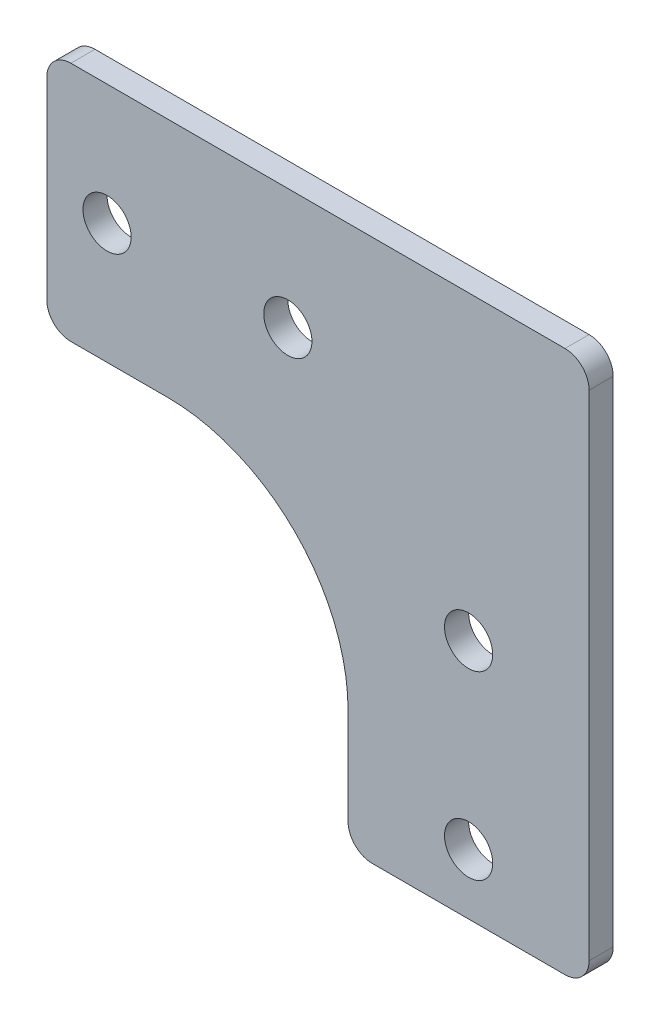
ISO-10303-21;
HEADER;
FILE_DESCRIPTION(('STEP AP214'),'2;1');
FILE_NAME('part.step','',(''),(''),'','','');
FILE_SCHEMA(('AUTOMOTIVE_DESIGN { 1 0 10303 214 1 1 1 1 }'));
ENDSEC;
DATA;
#1=APPLICATION_CONTEXT('core data for automotive mechanical design processes');
#2=APPLICATION_PROTOCOL_DEFINITION('international standard','automotive_design',2000,#1);
#3=PRODUCT_CONTEXT('',#1,'mechanical');
#4=PRODUCT('Part','Part','',(#3));
#5=PRODUCT_RELATED_PRODUCT_CATEGORY('part','',(#4));
#6=PRODUCT_DEFINITION_FORMATION('','',#4);
#7=PRODUCT_DEFINITION_CONTEXT('part definition',#1,'design');
#8=PRODUCT_DEFINITION('design','',#6,#7);
#9=PRODUCT_DEFINITION_SHAPE('','',#8);
#10=(LENGTH_UNIT() NAMED_UNIT(*) SI_UNIT(.MILLI.,.METRE.));
#11=(NAMED_UNIT(*) PLANE_ANGLE_UNIT() SI_UNIT($,.RADIAN.));
#12=(NAMED_UNIT(*) SI_UNIT($,.STERADIAN.) SOLID_ANGLE_UNIT());
#13=UNCERTAINTY_MEASURE_WITH_UNIT(LENGTH_MEASURE(1.E-05),#10,'distance_accuracy_value','');
#14=(GEOMETRIC_REPRESENTATION_CONTEXT(3) GLOBAL_UNCERTAINTY_ASSIGNED_CONTEXT((#13)) GLOBAL_UNIT_ASSIGNED_CONTEXT((#10,
#11,#12)) REPRESENTATION_CONTEXT('',''));
#15=CARTESIAN_POINT('',(0.,0.,0.));
#16=DIRECTION('',(0.,0.,1.));
#17=DIRECTION('',(1.,0.,0.));
#18=AXIS2_PLACEMENT_3D('',#15,#16,#17);
#19=CARTESIAN_POINT('',(-45.,0.,2.));
#20=DIRECTION('',(0.,-1.,0.));
#21=DIRECTION('',(0.,0.,-1.));
#22=AXIS2_PLACEMENT_3D('',#19,#20,#21);
#23=PLANE('',#22);
#24=DIRECTION('',(-1.,0.,0.));
#25=VECTOR('',#24,1.);
#26=CARTESIAN_POINT('',(-45.,0.,2.));
#27=LINE('',#26,#25);
#28=CARTESIAN_POINT('',(-2.00000000000002,0.,2.));
#29=VERTEX_POINT('',#28);
#30=CARTESIAN_POINT('',(-43.,0.,2.));
#31=VERTEX_POINT('',#30);
#32=EDGE_CURVE('E173',#29,#31,#27,.T.);
#33=ORIENTED_EDGE('',*,*,#32,.F.);
#34=DIRECTION('',(0.,0.,-1.));
#35=VECTOR('',#34,1.);
#36=CARTESIAN_POINT('',(-2.,0.,2.));
#37=LINE('',#36,#35);
#38=CARTESIAN_POINT('',(-2.00000000000002,0.,0.));
#39=VERTEX_POINT('',#38);
#40=EDGE_CURVE('E205',#29,#39,#37,.T.);
#41=ORIENTED_EDGE('',*,*,#40,.T.);
#42=DIRECTION('',(-1.,0.,0.));
#43=VECTOR('',#42,1.);
#44=CARTESIAN_POINT('',(-45.,0.,0.));
#45=LINE('',#44,#43);
#46=CARTESIAN_POINT('',(-43.,0.,0.));
#47=VERTEX_POINT('',#46);
#48=EDGE_CURVE('E155',#39,#47,#45,.T.);
#49=ORIENTED_EDGE('',*,*,#48,.T.);
#50=DIRECTION('',(0.,0.,-1.));
#51=VECTOR('',#50,1.);
#52=CARTESIAN_POINT('',(-43.,0.,2.));
#53=LINE('',#52,#51);
#54=EDGE_CURVE('E203',#47,#31,#53,.F.);
#55=ORIENTED_EDGE('',*,*,#54,.T.);
#56=EDGE_LOOP('',(#33,#41,#49,#55));
#57=FACE_BOUND('',#56,.T.);
#58=ADVANCED_FACE('F33',(#57),#23,.F.);
#59=CARTESIAN_POINT('',(-45.,-20.,2.));
#60=DIRECTION('',(1.,0.,0.));
#61=DIRECTION('',(0.,0.,-1.));
#62=AXIS2_PLACEMENT_3D('',#59,#60,#61);
#63=PLANE('',#62);
#64=DIRECTION('',(0.,-1.,0.));
#65=VECTOR('',#64,1.);
#66=CARTESIAN_POINT('',(-45.,-20.,0.));
#67=LINE('',#66,#65);
#68=CARTESIAN_POINT('',(-45.,-2.,0.));
#69=VERTEX_POINT('',#68);
#70=CARTESIAN_POINT('',(-45.,-18.,0.));
#71=VERTEX_POINT('',#70);
#72=EDGE_CURVE('E158',#69,#71,#67,.T.);
#73=ORIENTED_EDGE('',*,*,#72,.T.);
#74=DIRECTION('',(0.,0.,-1.));
#75=VECTOR('',#74,1.);
#76=CARTESIAN_POINT('',(-45.,-18.,2.));
#77=LINE('',#76,#75);
#78=CARTESIAN_POINT('',(-45.,-18.,2.));
#79=VERTEX_POINT('',#78);
#80=EDGE_CURVE('E11',#71,#79,#77,.F.);
#81=ORIENTED_EDGE('',*,*,#80,.T.);
#82=DIRECTION('',(0.,-1.,0.));
#83=VECTOR('',#82,1.);
#84=CARTESIAN_POINT('',(-45.,-20.,2.));
#85=LINE('',#84,#83);
#86=CARTESIAN_POINT('',(-45.,-2.,2.));
#87=VERTEX_POINT('',#86);
#88=EDGE_CURVE('E131',#87,#79,#85,.T.);
#89=ORIENTED_EDGE('',*,*,#88,.F.);
#90=DIRECTION('',(0.,0.,-1.));
#91=VECTOR('',#90,1.);
#92=CARTESIAN_POINT('',(-45.,-2.,2.));
#93=LINE('',#92,#91);
#94=EDGE_CURVE('E41',#87,#69,#93,.T.);
#95=ORIENTED_EDGE('',*,*,#94,.T.);
#96=EDGE_LOOP('',(#73,#81,#89,#95));
#97=FACE_BOUND('',#96,.T.);
#98=ADVANCED_FACE('F215',(#97),#63,.F.);
#99=CARTESIAN_POINT('',(-35.,-20.,2.));
#100=DIRECTION('',(0.,1.,0.));
#101=DIRECTION('',(0.,0.,1.));
#102=AXIS2_PLACEMENT_3D('',#99,#100,#101);
#103=PLANE('',#102);
#104=DIRECTION('',(1.,0.,0.));
#105=VECTOR('',#104,1.);
#106=CARTESIAN_POINT('',(-35.,-20.,2.));
#107=LINE('',#106,#105);
#108=CARTESIAN_POINT('',(-43.,-20.,2.));
#109=VERTEX_POINT('',#108);
#110=CARTESIAN_POINT('',(-35.,-20.,2.));
#111=VERTEX_POINT('',#110);
#112=EDGE_CURVE('E121',#109,#111,#107,.T.);
#113=ORIENTED_EDGE('',*,*,#112,.F.);
#114=DIRECTION('',(0.,0.,-1.));
#115=VECTOR('',#114,1.);
#116=CARTESIAN_POINT('',(-43.,-20.,2.));
#117=LINE('',#116,#115);
#118=CARTESIAN_POINT('',(-43.,-20.,0.));
#119=VERTEX_POINT('',#118);
#120=EDGE_CURVE('E209',#109,#119,#117,.T.);
#121=ORIENTED_EDGE('',*,*,#120,.T.);
#122=DIRECTION('',(1.,0.,0.));
#123=VECTOR('',#122,1.);
#124=CARTESIAN_POINT('',(-35.,-20.,0.));
#125=LINE('',#124,#123);
#126=CARTESIAN_POINT('',(-35.,-20.,0.));
#127=VERTEX_POINT('',#126);
#128=EDGE_CURVE('E137',#119,#127,#125,.T.);
#129=ORIENTED_EDGE('',*,*,#128,.T.);
#130=DIRECTION('',(0.,0.,-1.));
#131=VECTOR('',#130,1.);
#132=CARTESIAN_POINT('',(-35.,-20.,2.));
#133=LINE('',#132,#131);
#134=EDGE_CURVE('E134',#111,#127,#133,.T.);
#135=ORIENTED_EDGE('',*,*,#134,.F.);
#136=EDGE_LOOP('',(#113,#121,#129,#135));
#137=FACE_BOUND('',#136,.T.);
#138=ADVANCED_FACE('F135',(#137),#103,.F.);
#139=CARTESIAN_POINT('',(-35.,-35.,2.));
#140=DIRECTION('',(0.,0.,-1.));
#141=DIRECTION('',(-1.,0.,0.));
#142=AXIS2_PLACEMENT_3D('',#139,#140,#141);
#143=CYLINDRICAL_SURFACE('',#142,15.);
#144=CARTESIAN_POINT('',(-35.,-35.,0.));
#145=DIRECTION('',(0.,0.,-1.));
#146=DIRECTION('',(1.,0.,0.));
#147=AXIS2_PLACEMENT_3D('',#144,#145,#146);
#148=CIRCLE('',#147,15.);
#149=CARTESIAN_POINT('',(-20.,-35.,0.));
#150=VERTEX_POINT('',#149);
#151=EDGE_CURVE('E163',#127,#150,#148,.T.);
#152=ORIENTED_EDGE('',*,*,#151,.T.);
#153=DIRECTION('',(0.,0.,-1.));
#154=VECTOR('',#153,1.);
#155=CARTESIAN_POINT('',(-20.,-35.,2.));
#156=LINE('',#155,#154);
#157=CARTESIAN_POINT('',(-20.,-35.,2.));
#158=VERTEX_POINT('',#157);
#159=EDGE_CURVE('E141',#158,#150,#156,.T.);
#160=ORIENTED_EDGE('',*,*,#159,.F.);
#161=CARTESIAN_POINT('',(-35.,-35.,2.));
#162=DIRECTION('',(0.,0.,-1.));
#163=DIRECTION('',(1.,0.,0.));
#164=AXIS2_PLACEMENT_3D('',#161,#162,#163);
#165=CIRCLE('',#164,15.);
#166=EDGE_CURVE('E126',#111,#158,#165,.T.);
#167=ORIENTED_EDGE('',*,*,#166,.F.);
#168=ORIENTED_EDGE('',*,*,#134,.T.);
#169=EDGE_LOOP('',(#152,#160,#167,#168));
#170=FACE_BOUND('',#169,.T.);
#171=ADVANCED_FACE('F143',(#170),#143,.F.);
#172=CARTESIAN_POINT('',(-20.,-45.,2.));
#173=DIRECTION('',(1.,0.,0.));
#174=DIRECTION('',(0.,0.,-1.));
#175=AXIS2_PLACEMENT_3D('',#172,#173,#174);
#176=PLANE('',#175);
#177=DIRECTION('',(0.,-1.,0.));
#178=VECTOR('',#177,1.);
#179=CARTESIAN_POINT('',(-20.,-45.,0.));
#180=LINE('',#179,#178);
#181=CARTESIAN_POINT('',(-20.,-43.,0.));
#182=VERTEX_POINT('',#181);
#183=EDGE_CURVE('E165',#150,#182,#180,.T.);
#184=ORIENTED_EDGE('',*,*,#183,.T.);
#185=DIRECTION('',(0.,0.,-1.));
#186=VECTOR('',#185,1.);
#187=CARTESIAN_POINT('',(-20.,-43.,2.));
#188=LINE('',#187,#186);
#189=CARTESIAN_POINT('',(-20.,-43.,2.));
#190=VERTEX_POINT('',#189);
#191=EDGE_CURVE('E48',#182,#190,#188,.F.);
#192=ORIENTED_EDGE('',*,*,#191,.T.);
#193=DIRECTION('',(0.,-1.,0.));
#194=VECTOR('',#193,1.);
#195=CARTESIAN_POINT('',(-20.,-45.,2.));
#196=LINE('',#195,#194);
#197=EDGE_CURVE('E145',#158,#190,#196,.T.);
#198=ORIENTED_EDGE('',*,*,#197,.F.);
#199=ORIENTED_EDGE('',*,*,#159,.T.);
#200=EDGE_LOOP('',(#184,#192,#198,#199));
#201=FACE_BOUND('',#200,.T.);
#202=ADVANCED_FACE('F327',(#201),#176,.F.);
#203=CARTESIAN_POINT('',(0.,-45.,2.));
#204=DIRECTION('',(0.,1.,0.));
#205=DIRECTION('',(0.,0.,1.));
#206=AXIS2_PLACEMENT_3D('',#203,#204,#205);
#207=PLANE('',#206);
#208=DIRECTION('',(1.,0.,0.));
#209=VECTOR('',#208,1.);
#210=CARTESIAN_POINT('',(0.,-45.,0.));
#211=LINE('',#210,#209);
#212=CARTESIAN_POINT('',(-18.,-45.,0.));
#213=VERTEX_POINT('',#212);
#214=CARTESIAN_POINT('',(-1.99999999999999,-45.,0.));
#215=VERTEX_POINT('',#214);
#216=EDGE_CURVE('E167',#213,#215,#211,.T.);
#217=ORIENTED_EDGE('',*,*,#216,.T.);
#218=DIRECTION('',(0.,0.,-1.));
#219=VECTOR('',#218,1.);
#220=CARTESIAN_POINT('',(-1.99999999999999,-45.,2.));
#221=LINE('',#220,#219);
#222=CARTESIAN_POINT('',(-1.99999999999999,-45.,2.));
#223=VERTEX_POINT('',#222);
#224=EDGE_CURVE('E192',#215,#223,#221,.F.);
#225=ORIENTED_EDGE('',*,*,#224,.T.);
#226=DIRECTION('',(1.,0.,0.));
#227=VECTOR('',#226,1.);
#228=CARTESIAN_POINT('',(0.,-45.,2.));
#229=LINE('',#228,#227);
#230=CARTESIAN_POINT('',(-18.,-45.,2.));
#231=VERTEX_POINT('',#230);
#232=EDGE_CURVE('E147',#231,#223,#229,.T.);
#233=ORIENTED_EDGE('',*,*,#232,.F.);
#234=DIRECTION('',(0.,0.,-1.));
#235=VECTOR('',#234,1.);
#236=CARTESIAN_POINT('',(-18.,-45.,2.));
#237=LINE('',#236,#235);
#238=EDGE_CURVE('E189',#231,#213,#237,.T.);
#239=ORIENTED_EDGE('',*,*,#238,.T.);
#240=EDGE_LOOP('',(#217,#225,#233,#239));
#241=FACE_BOUND('',#240,.T.);
#242=ADVANCED_FACE('F322',(#241),#207,.F.);
#243=CARTESIAN_POINT('',(0.,0.,2.));
#244=DIRECTION('',(-1.,0.,0.));
#245=DIRECTION('',(0.,-1.,0.));
#246=AXIS2_PLACEMENT_3D('',#243,#244,#245);
#247=PLANE('',#246);
#248=DIRECTION('',(0.,1.,0.));
#249=VECTOR('',#248,1.);
#250=CARTESIAN_POINT('',(0.,0.,2.));
#251=LINE('',#250,#249);
#252=CARTESIAN_POINT('',(0.,-43.,2.));
#253=VERTEX_POINT('',#252);
#254=CARTESIAN_POINT('',(0.,-2.,2.));
#255=VERTEX_POINT('',#254);
#256=EDGE_CURVE('E152',#253,#255,#251,.T.);
#257=ORIENTED_EDGE('',*,*,#256,.F.);
#258=DIRECTION('',(0.,0.,-1.));
#259=VECTOR('',#258,1.);
#260=CARTESIAN_POINT('',(0.,-43.,2.));
#261=LINE('',#260,#259);
#262=CARTESIAN_POINT('',(0.,-43.,0.));
#263=VERTEX_POINT('',#262);
#264=EDGE_CURVE('E176',#253,#263,#261,.T.);
#265=ORIENTED_EDGE('',*,*,#264,.T.);
#266=DIRECTION('',(0.,1.,0.));
#267=VECTOR('',#266,1.);
#268=CARTESIAN_POINT('',(0.,0.,0.));
#269=LINE('',#268,#267);
#270=CARTESIAN_POINT('',(0.,-2.,0.));
#271=VERTEX_POINT('',#270);
#272=EDGE_CURVE('E170',#263,#271,#269,.T.);
#273=ORIENTED_EDGE('',*,*,#272,.T.);
#274=DIRECTION('',(0.,0.,-1.));
#275=VECTOR('',#274,1.);
#276=CARTESIAN_POINT('',(0.,-2.,2.));
#277=LINE('',#276,#275);
#278=EDGE_CURVE('E140',#271,#255,#277,.F.);
#279=ORIENTED_EDGE('',*,*,#278,.T.);
#280=EDGE_LOOP('',(#257,#265,#273,#279));
#281=FACE_BOUND('',#280,.T.);
#282=ADVANCED_FACE('F264',(#281),#247,.F.);
#283=CARTESIAN_POINT('',(-35.,-35.,2.));
#284=DIRECTION('',(0.,0.,1.));
#285=DIRECTION('',(1.,0.,0.));
#286=AXIS2_PLACEMENT_3D('',#283,#284,#285);
#287=PLANE('',#286);
#288=CARTESIAN_POINT('',(-10.,-25.,2.));
#289=DIRECTION('',(0.,0.,1.));
#290=DIRECTION('',(1.,0.,0.));
#291=AXIS2_PLACEMENT_3D('',#288,#289,#290);
#292=CIRCLE('',#291,2.);
#293=CARTESIAN_POINT('',(-8.,-25.,2.));
#294=VERTEX_POINT('',#293);
#295=EDGE_CURVE('E246',#294,#294,#292,.T.);
#296=ORIENTED_EDGE('',*,*,#295,.F.);
#297=EDGE_LOOP('',(#296));
#298=FACE_BOUND('',#297,.T.);
#299=CARTESIAN_POINT('',(-25.,-10.,2.));
#300=DIRECTION('',(0.,0.,1.));
#301=DIRECTION('',(1.,0.,0.));
#302=AXIS2_PLACEMENT_3D('',#299,#300,#301);
#303=CIRCLE('',#302,2.);
#304=CARTESIAN_POINT('',(-23.,-10.,2.));
#305=VERTEX_POINT('',#304);
#306=EDGE_CURVE('E240',#305,#305,#303,.T.);
#307=ORIENTED_EDGE('',*,*,#306,.F.);
#308=EDGE_LOOP('',(#307));
#309=FACE_BOUND('',#308,.T.);
#310=CARTESIAN_POINT('',(-40.,-10.,2.));
#311=DIRECTION('',(0.,0.,1.));
#312=DIRECTION('',(1.,0.,0.));
#313=AXIS2_PLACEMENT_3D('',#310,#311,#312);
#314=CIRCLE('',#313,2.);
#315=CARTESIAN_POINT('',(-38.,-10.,2.));
#316=VERTEX_POINT('',#315);
#317=EDGE_CURVE('E234',#316,#316,#314,.T.);
#318=ORIENTED_EDGE('',*,*,#317,.F.);
#319=EDGE_LOOP('',(#318));
#320=FACE_BOUND('',#319,.T.);
#321=CARTESIAN_POINT('',(-10.,-40.,2.));
#322=DIRECTION('',(0.,0.,1.));
#323=DIRECTION('',(1.,0.,0.));
#324=AXIS2_PLACEMENT_3D('',#321,#322,#323);
#325=CIRCLE('',#324,2.);
#326=CARTESIAN_POINT('',(-8.,-40.,2.));
#327=VERTEX_POINT('',#326);
#328=EDGE_CURVE('E228',#327,#327,#325,.T.);
#329=ORIENTED_EDGE('',*,*,#328,.F.);
#330=EDGE_LOOP('',(#329));
#331=FACE_BOUND('',#330,.T.);
#332=ORIENTED_EDGE('',*,*,#232,.T.);
#333=CARTESIAN_POINT('',(-1.99999999999999,-43.,2.));
#334=DIRECTION('',(0.,0.,1.));
#335=DIRECTION('',(1.,0.,0.));
#336=AXIS2_PLACEMENT_3D('',#333,#334,#335);
#337=CIRCLE('',#336,2.);
#338=EDGE_CURVE('E201',#223,#253,#337,.T.);
#339=ORIENTED_EDGE('',*,*,#338,.T.);
#340=ORIENTED_EDGE('',*,*,#256,.T.);
#341=CARTESIAN_POINT('',(-2.,-2.,2.));
#342=DIRECTION('',(0.,0.,1.));
#343=DIRECTION('',(1.,0.,0.));
#344=AXIS2_PLACEMENT_3D('',#341,#342,#343);
#345=CIRCLE('',#344,2.);
#346=EDGE_CURVE('E199',#255,#29,#345,.T.);
#347=ORIENTED_EDGE('',*,*,#346,.T.);
#348=ORIENTED_EDGE('',*,*,#32,.T.);
#349=CARTESIAN_POINT('',(-43.,-2.,2.));
#350=DIRECTION('',(0.,0.,1.));
#351=DIRECTION('',(1.,0.,0.));
#352=AXIS2_PLACEMENT_3D('',#349,#350,#351);
#353=CIRCLE('',#352,2.);
#354=EDGE_CURVE('E194',#31,#87,#353,.T.);
#355=ORIENTED_EDGE('',*,*,#354,.T.);
#356=ORIENTED_EDGE('',*,*,#88,.T.);
#357=CARTESIAN_POINT('',(-43.,-18.,2.));
#358=DIRECTION('',(0.,0.,1.));
#359=DIRECTION('',(1.,0.,0.));
#360=AXIS2_PLACEMENT_3D('',#357,#358,#359);
#361=CIRCLE('',#360,2.);
#362=EDGE_CURVE('E56',#79,#109,#361,.T.);
#363=ORIENTED_EDGE('',*,*,#362,.T.);
#364=ORIENTED_EDGE('',*,*,#112,.T.);
#365=ORIENTED_EDGE('',*,*,#166,.T.);
#366=ORIENTED_EDGE('',*,*,#197,.T.);
#367=CARTESIAN_POINT('',(-18.,-43.,2.));
#368=DIRECTION('',(0.,0.,1.));
#369=DIRECTION('',(1.,0.,0.));
#370=AXIS2_PLACEMENT_3D('',#367,#368,#369);
#371=CIRCLE('',#370,2.);
#372=EDGE_CURVE('E197',#190,#231,#371,.T.);
#373=ORIENTED_EDGE('',*,*,#372,.T.);
#374=EDGE_LOOP('',(#332,#339,#340,#347,#348,#355,#356,#363,#364,#365,#366,#373));
#375=FACE_BOUND('',#374,.T.);
#376=ADVANCED_FACE('F124',(#298,#309,#320,#331,#375),#287,.T.);
#377=CARTESIAN_POINT('',(-35.,-35.,0.));
#378=DIRECTION('',(0.,0.,1.));
#379=DIRECTION('',(1.,0.,0.));
#380=AXIS2_PLACEMENT_3D('',#377,#378,#379);
#381=PLANE('',#380);
#382=CARTESIAN_POINT('',(-10.,-25.,0.));
#383=DIRECTION('',(0.,0.,1.));
#384=DIRECTION('',(1.,0.,0.));
#385=AXIS2_PLACEMENT_3D('',#382,#383,#384);
#386=CIRCLE('',#385,2.);
#387=CARTESIAN_POINT('',(-8.,-25.,0.));
#388=VERTEX_POINT('',#387);
#389=EDGE_CURVE('E231',#388,#388,#386,.T.);
#390=ORIENTED_EDGE('',*,*,#389,.T.);
#391=EDGE_LOOP('',(#390));
#392=FACE_BOUND('',#391,.T.);
#393=CARTESIAN_POINT('',(-25.,-10.,0.));
#394=DIRECTION('',(0.,0.,1.));
#395=DIRECTION('',(1.,0.,0.));
#396=AXIS2_PLACEMENT_3D('',#393,#394,#395);
#397=CIRCLE('',#396,2.);
#398=CARTESIAN_POINT('',(-23.,-10.,0.));
#399=VERTEX_POINT('',#398);
#400=EDGE_CURVE('E243',#399,#399,#397,.T.);
#401=ORIENTED_EDGE('',*,*,#400,.T.);
#402=EDGE_LOOP('',(#401));
#403=FACE_BOUND('',#402,.T.);
#404=CARTESIAN_POINT('',(-40.,-10.,0.));
#405=DIRECTION('',(0.,0.,1.));
#406=DIRECTION('',(1.,0.,0.));
#407=AXIS2_PLACEMENT_3D('',#404,#405,#406);
#408=CIRCLE('',#407,2.);
#409=CARTESIAN_POINT('',(-38.,-10.,0.));
#410=VERTEX_POINT('',#409);
#411=EDGE_CURVE('E237',#410,#410,#408,.T.);
#412=ORIENTED_EDGE('',*,*,#411,.T.);
#413=EDGE_LOOP('',(#412));
#414=FACE_BOUND('',#413,.T.);
#415=CARTESIAN_POINT('',(-10.,-40.,0.));
#416=DIRECTION('',(0.,0.,1.));
#417=DIRECTION('',(1.,0.,0.));
#418=AXIS2_PLACEMENT_3D('',#415,#416,#417);
#419=CIRCLE('',#418,2.);
#420=CARTESIAN_POINT('',(-8.,-40.,0.));
#421=VERTEX_POINT('',#420);
#422=EDGE_CURVE('E159',#421,#421,#419,.T.);
#423=ORIENTED_EDGE('',*,*,#422,.T.);
#424=EDGE_LOOP('',(#423));
#425=FACE_BOUND('',#424,.T.);
#426=ORIENTED_EDGE('',*,*,#272,.F.);
#427=CARTESIAN_POINT('',(-1.99999999999999,-43.,0.));
#428=DIRECTION('',(0.,0.,1.));
#429=DIRECTION('',(1.,0.,0.));
#430=AXIS2_PLACEMENT_3D('',#427,#428,#429);
#431=CIRCLE('',#430,2.);
#432=EDGE_CURVE('E187',#263,#215,#431,.F.);
#433=ORIENTED_EDGE('',*,*,#432,.T.);
#434=ORIENTED_EDGE('',*,*,#216,.F.);
#435=CARTESIAN_POINT('',(-18.,-43.,0.));
#436=DIRECTION('',(0.,0.,1.));
#437=DIRECTION('',(1.,0.,0.));
#438=AXIS2_PLACEMENT_3D('',#435,#436,#437);
#439=CIRCLE('',#438,2.);
#440=EDGE_CURVE('E183',#213,#182,#439,.F.);
#441=ORIENTED_EDGE('',*,*,#440,.T.);
#442=ORIENTED_EDGE('',*,*,#183,.F.);
#443=ORIENTED_EDGE('',*,*,#151,.F.);
#444=ORIENTED_EDGE('',*,*,#128,.F.);
#445=CARTESIAN_POINT('',(-43.,-18.,0.));
#446=DIRECTION('',(0.,0.,1.));
#447=DIRECTION('',(1.,0.,0.));
#448=AXIS2_PLACEMENT_3D('',#445,#446,#447);
#449=CIRCLE('',#448,2.);
#450=EDGE_CURVE('E181',#119,#71,#449,.F.);
#451=ORIENTED_EDGE('',*,*,#450,.T.);
#452=ORIENTED_EDGE('',*,*,#72,.F.);
#453=CARTESIAN_POINT('',(-43.,-2.,0.));
#454=DIRECTION('',(0.,0.,1.));
#455=DIRECTION('',(1.,0.,0.));
#456=AXIS2_PLACEMENT_3D('',#453,#454,#455);
#457=CIRCLE('',#456,2.);
#458=EDGE_CURVE('E179',#69,#47,#457,.F.);
#459=ORIENTED_EDGE('',*,*,#458,.T.);
#460=ORIENTED_EDGE('',*,*,#48,.F.);
#461=CARTESIAN_POINT('',(-2.,-2.,0.));
#462=DIRECTION('',(0.,0.,1.));
#463=DIRECTION('',(1.,0.,0.));
#464=AXIS2_PLACEMENT_3D('',#461,#462,#463);
#465=CIRCLE('',#464,2.);
#466=EDGE_CURVE('E185',#39,#271,#465,.F.);
#467=ORIENTED_EDGE('',*,*,#466,.T.);
#468=EDGE_LOOP('',(#426,#433,#434,#441,#442,#443,#444,#451,#452,#459,#460,#467));
#469=FACE_BOUND('',#468,.T.);
#470=ADVANCED_FACE('F221',(#392,#403,#414,#425,#469),#381,.F.);
#471=CARTESIAN_POINT('',(-10.,-40.,0.));
#472=DIRECTION('',(0.,0.,1.));
#473=DIRECTION('',(1.,0.,0.));
#474=AXIS2_PLACEMENT_3D('',#471,#472,#473);
#475=CYLINDRICAL_SURFACE('',#474,2.);
#476=ORIENTED_EDGE('',*,*,#422,.F.);
#477=EDGE_LOOP('',(#476));
#478=FACE_BOUND('',#477,.T.);
#479=ORIENTED_EDGE('',*,*,#328,.T.);
#480=EDGE_LOOP('',(#479));
#481=FACE_BOUND('',#480,.T.);
#482=ADVANCED_FACE('F272',(#478,#481),#475,.F.);
#483=CARTESIAN_POINT('',(-40.,-10.,0.));
#484=DIRECTION('',(0.,0.,1.));
#485=DIRECTION('',(1.,0.,0.));
#486=AXIS2_PLACEMENT_3D('',#483,#484,#485);
#487=CYLINDRICAL_SURFACE('',#486,2.);
#488=ORIENTED_EDGE('',*,*,#411,.F.);
#489=EDGE_LOOP('',(#488));
#490=FACE_BOUND('',#489,.T.);
#491=ORIENTED_EDGE('',*,*,#317,.T.);
#492=EDGE_LOOP('',(#491));
#493=FACE_BOUND('',#492,.T.);
#494=ADVANCED_FACE('F274',(#490,#493),#487,.F.);
#495=CARTESIAN_POINT('',(-25.,-10.,0.));
#496=DIRECTION('',(0.,0.,1.));
#497=DIRECTION('',(1.,0.,0.));
#498=AXIS2_PLACEMENT_3D('',#495,#496,#497);
#499=CYLINDRICAL_SURFACE('',#498,2.);
#500=ORIENTED_EDGE('',*,*,#400,.F.);
#501=EDGE_LOOP('',(#500));
#502=FACE_BOUND('',#501,.T.);
#503=ORIENTED_EDGE('',*,*,#306,.T.);
#504=EDGE_LOOP('',(#503));
#505=FACE_BOUND('',#504,.T.);
#506=ADVANCED_FACE('F258',(#502,#505),#499,.F.);
#507=CARTESIAN_POINT('',(-10.,-25.,0.));
#508=DIRECTION('',(0.,0.,1.));
#509=DIRECTION('',(1.,0.,0.));
#510=AXIS2_PLACEMENT_3D('',#507,#508,#509);
#511=CYLINDRICAL_SURFACE('',#510,2.);
#512=ORIENTED_EDGE('',*,*,#389,.F.);
#513=EDGE_LOOP('',(#512));
#514=FACE_BOUND('',#513,.T.);
#515=ORIENTED_EDGE('',*,*,#295,.T.);
#516=EDGE_LOOP('',(#515));
#517=FACE_BOUND('',#516,.T.);
#518=ADVANCED_FACE('F254',(#514,#517),#511,.F.);
#519=CARTESIAN_POINT('',(-1.99999999999999,-43.,2.));
#520=DIRECTION('',(0.,0.,-1.));
#521=DIRECTION('',(-1.,0.,0.));
#522=AXIS2_PLACEMENT_3D('',#519,#520,#521);
#523=CYLINDRICAL_SURFACE('',#522,2.);
#524=ORIENTED_EDGE('',*,*,#338,.F.);
#525=ORIENTED_EDGE('',*,*,#224,.F.);
#526=ORIENTED_EDGE('',*,*,#432,.F.);
#527=ORIENTED_EDGE('',*,*,#264,.F.);
#528=EDGE_LOOP('',(#524,#525,#526,#527));
#529=FACE_BOUND('',#528,.T.);
#530=ADVANCED_FACE('F257',(#529),#523,.T.);
#531=CARTESIAN_POINT('',(-2.,-2.,2.));
#532=DIRECTION('',(0.,0.,-1.));
#533=DIRECTION('',(-1.,0.,0.));
#534=AXIS2_PLACEMENT_3D('',#531,#532,#533);
#535=CYLINDRICAL_SURFACE('',#534,2.);
#536=ORIENTED_EDGE('',*,*,#346,.F.);
#537=ORIENTED_EDGE('',*,*,#278,.F.);
#538=ORIENTED_EDGE('',*,*,#466,.F.);
#539=ORIENTED_EDGE('',*,*,#40,.F.);
#540=EDGE_LOOP('',(#536,#537,#538,#539));
#541=FACE_BOUND('',#540,.T.);
#542=ADVANCED_FACE('F297',(#541),#535,.T.);
#543=CARTESIAN_POINT('',(-18.,-43.,2.));
#544=DIRECTION('',(0.,0.,-1.));
#545=DIRECTION('',(-1.,0.,0.));
#546=AXIS2_PLACEMENT_3D('',#543,#544,#545);
#547=CYLINDRICAL_SURFACE('',#546,2.);
#548=ORIENTED_EDGE('',*,*,#372,.F.);
#549=ORIENTED_EDGE('',*,*,#191,.F.);
#550=ORIENTED_EDGE('',*,*,#440,.F.);
#551=ORIENTED_EDGE('',*,*,#238,.F.);
#552=EDGE_LOOP('',(#548,#549,#550,#551));
#553=FACE_BOUND('',#552,.T.);
#554=ADVANCED_FACE('F301',(#553),#547,.T.);
#555=CARTESIAN_POINT('',(-43.,-18.,2.));
#556=DIRECTION('',(0.,0.,-1.));
#557=DIRECTION('',(-1.,0.,0.));
#558=AXIS2_PLACEMENT_3D('',#555,#556,#557);
#559=CYLINDRICAL_SURFACE('',#558,2.);
#560=ORIENTED_EDGE('',*,*,#362,.F.);
#561=ORIENTED_EDGE('',*,*,#80,.F.);
#562=ORIENTED_EDGE('',*,*,#450,.F.);
#563=ORIENTED_EDGE('',*,*,#120,.F.);
#564=EDGE_LOOP('',(#560,#561,#562,#563));
#565=FACE_BOUND('',#564,.T.);
#566=ADVANCED_FACE('F224',(#565),#559,.T.);
#567=CARTESIAN_POINT('',(-43.,-2.,2.));
#568=DIRECTION('',(0.,0.,-1.));
#569=DIRECTION('',(-1.,0.,0.));
#570=AXIS2_PLACEMENT_3D('',#567,#568,#569);
#571=CYLINDRICAL_SURFACE('',#570,2.);
#572=ORIENTED_EDGE('',*,*,#354,.F.);
#573=ORIENTED_EDGE('',*,*,#54,.F.);
#574=ORIENTED_EDGE('',*,*,#458,.F.);
#575=ORIENTED_EDGE('',*,*,#94,.F.);
#576=EDGE_LOOP('',(#572,#573,#574,#575));
#577=FACE_BOUND('',#576,.T.);
#578=ADVANCED_FACE('F35',(#577),#571,.T.);
#579=CLOSED_SHELL('',(#58,#98,#138,#171,#202,#242,#282,#376,#470,#482,#494,#506,#518,#530,#542,
#554,#566,#578));
#580=MANIFOLD_SOLID_BREP('B2',#579);
#581=ADVANCED_BREP_SHAPE_REPRESENTATION('',(#18,#580),#14);
#582=SHAPE_DEFINITION_REPRESENTATION(#9,#581);
ENDSEC;
END-ISO-10303-21;
